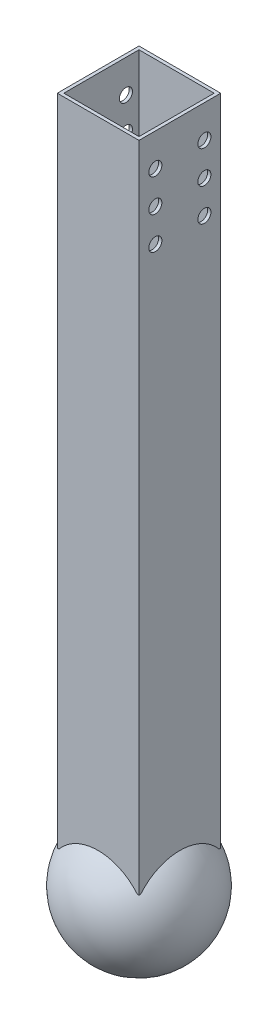
ISO-10303-21;
HEADER;
FILE_DESCRIPTION(('STEP AP214'),'2;1');
FILE_NAME('part.step','',(''),(''),'','','');
FILE_SCHEMA(('AUTOMOTIVE_DESIGN { 1 0 10303 214 1 1 1 1 }'));
ENDSEC;
DATA;
#1=APPLICATION_CONTEXT('core data for automotive mechanical design processes');
#2=APPLICATION_PROTOCOL_DEFINITION('international standard','automotive_design',2000,#1);
#3=PRODUCT_CONTEXT('',#1,'mechanical');
#4=PRODUCT('Part','Part','',(#3));
#5=PRODUCT_RELATED_PRODUCT_CATEGORY('part','',(#4));
#6=PRODUCT_DEFINITION_FORMATION('','',#4);
#7=PRODUCT_DEFINITION_CONTEXT('part definition',#1,'design');
#8=PRODUCT_DEFINITION('design','',#6,#7);
#9=PRODUCT_DEFINITION_SHAPE('','',#8);
#10=(LENGTH_UNIT() NAMED_UNIT(*) SI_UNIT(.MILLI.,.METRE.));
#11=(NAMED_UNIT(*) PLANE_ANGLE_UNIT() SI_UNIT($,.RADIAN.));
#12=(NAMED_UNIT(*) SI_UNIT($,.STERADIAN.) SOLID_ANGLE_UNIT());
#13=UNCERTAINTY_MEASURE_WITH_UNIT(LENGTH_MEASURE(1.E-05),#10,'distance_accuracy_value','');
#14=(GEOMETRIC_REPRESENTATION_CONTEXT(3) GLOBAL_UNCERTAINTY_ASSIGNED_CONTEXT((#13)) GLOBAL_UNIT_ASSIGNED_CONTEXT((#10,
#11,#12)) REPRESENTATION_CONTEXT('',''));
#15=CARTESIAN_POINT('',(0.,0.,0.));
#16=DIRECTION('',(0.,0.,1.));
#17=DIRECTION('',(1.,0.,0.));
#18=AXIS2_PLACEMENT_3D('',#15,#16,#17);
#19=CARTESIAN_POINT('',(0.,0.,0.));
#20=DIRECTION('',(0.,1.,0.));
#21=DIRECTION('',(0.,0.,1.));
#22=AXIS2_PLACEMENT_3D('',#19,#20,#21);
#23=PLANE('',#22);
#24=CARTESIAN_POINT('',(0.,0.,0.));
#25=DIRECTION('',(0.,1.,0.));
#26=DIRECTION('',(0.,0.,1.));
#27=AXIS2_PLACEMENT_3D('',#24,#25,#26);
#28=CIRCLE('',#27,17.3205080756888);
#29=CARTESIAN_POINT('',(-11.9895788082818,0.,12.5));
#30=VERTEX_POINT('',#29);
#31=CARTESIAN_POINT('',(-12.5,0.,11.9895788082818));
#32=VERTEX_POINT('',#31);
#33=EDGE_CURVE('E277',#30,#32,#28,.F.);
#34=ORIENTED_EDGE('',*,*,#33,.F.);
#35=DIRECTION('',(1.,0.,0.));
#36=VECTOR('',#35,1.);
#37=CARTESIAN_POINT('',(-12.5,0.,12.5));
#38=LINE('',#37,#36);
#39=CARTESIAN_POINT('',(-12.5,0.,12.5));
#40=VERTEX_POINT('',#39);
#41=EDGE_CURVE('E319',#40,#30,#38,.T.);
#42=ORIENTED_EDGE('',*,*,#41,.F.);
#43=DIRECTION('',(0.,0.,1.));
#44=VECTOR('',#43,1.);
#45=CARTESIAN_POINT('',(-12.5,0.,-12.5));
#46=LINE('',#45,#44);
#47=EDGE_CURVE('E333',#32,#40,#46,.T.);
#48=ORIENTED_EDGE('',*,*,#47,.F.);
#49=EDGE_LOOP('',(#34,#42,#48));
#50=FACE_BOUND('',#49,.T.);
#51=ADVANCED_FACE('F37',(#50),#23,.F.);
#52=CARTESIAN_POINT('',(-12.5,0.,-11.9895788082818));
#53=VERTEX_POINT('',#52);
#54=CARTESIAN_POINT('',(-11.9895788082818,0.,-12.5));
#55=VERTEX_POINT('',#54);
#56=EDGE_CURVE('E278',#53,#55,#28,.F.);
#57=ORIENTED_EDGE('',*,*,#56,.F.);
#58=CARTESIAN_POINT('',(-12.5,0.,-12.5));
#59=VERTEX_POINT('',#58);
#60=EDGE_CURVE('E334',#59,#53,#46,.T.);
#61=ORIENTED_EDGE('',*,*,#60,.F.);
#62=DIRECTION('',(-1.,0.,0.));
#63=VECTOR('',#62,1.);
#64=CARTESIAN_POINT('',(-12.5,0.,-12.5));
#65=LINE('',#64,#63);
#66=EDGE_CURVE('E328',#55,#59,#65,.T.);
#67=ORIENTED_EDGE('',*,*,#66,.F.);
#68=EDGE_LOOP('',(#57,#61,#67));
#69=FACE_BOUND('',#68,.T.);
#70=ADVANCED_FACE('F355',(#69),#23,.F.);
#71=CARTESIAN_POINT('',(11.9895788082818,0.,-12.5));
#72=VERTEX_POINT('',#71);
#73=CARTESIAN_POINT('',(12.5,0.,-11.9895788082818));
#74=VERTEX_POINT('',#73);
#75=EDGE_CURVE('E283',#72,#74,#28,.F.);
#76=ORIENTED_EDGE('',*,*,#75,.F.);
#77=CARTESIAN_POINT('',(12.5,0.,-12.5));
#78=VERTEX_POINT('',#77);
#79=EDGE_CURVE('E330',#78,#72,#65,.T.);
#80=ORIENTED_EDGE('',*,*,#79,.F.);
#81=DIRECTION('',(0.,0.,-1.));
#82=VECTOR('',#81,1.);
#83=CARTESIAN_POINT('',(12.5,0.,-12.5));
#84=LINE('',#83,#82);
#85=EDGE_CURVE('E314',#74,#78,#84,.T.);
#86=ORIENTED_EDGE('',*,*,#85,.F.);
#87=EDGE_LOOP('',(#76,#80,#86));
#88=FACE_BOUND('',#87,.T.);
#89=ADVANCED_FACE('F389',(#88),#23,.F.);
#90=CARTESIAN_POINT('',(0.,200.,0.));
#91=DIRECTION('',(0.,1.,0.));
#92=DIRECTION('',(0.,0.,1.));
#93=AXIS2_PLACEMENT_3D('',#90,#91,#92);
#94=PLANE('',#93);
#95=DIRECTION('',(0.,0.,-1.));
#96=VECTOR('',#95,1.);
#97=CARTESIAN_POINT('',(12.5,200.,-12.5));
#98=LINE('',#97,#96);
#99=CARTESIAN_POINT('',(12.5,200.,12.5));
#100=VERTEX_POINT('',#99);
#101=CARTESIAN_POINT('',(12.5,200.,-12.5));
#102=VERTEX_POINT('',#101);
#103=EDGE_CURVE('E315',#100,#102,#98,.T.);
#104=ORIENTED_EDGE('',*,*,#103,.T.);
#105=DIRECTION('',(-1.,0.,0.));
#106=VECTOR('',#105,1.);
#107=CARTESIAN_POINT('',(-12.5,200.,-12.5));
#108=LINE('',#107,#106);
#109=CARTESIAN_POINT('',(-12.5,200.,-12.5));
#110=VERTEX_POINT('',#109);
#111=EDGE_CURVE('E318',#102,#110,#108,.T.);
#112=ORIENTED_EDGE('',*,*,#111,.T.);
#113=DIRECTION('',(0.,0.,1.));
#114=VECTOR('',#113,1.);
#115=CARTESIAN_POINT('',(-12.5,200.,-12.5));
#116=LINE('',#115,#114);
#117=CARTESIAN_POINT('',(-12.5,200.,12.5));
#118=VERTEX_POINT('',#117);
#119=EDGE_CURVE('E321',#110,#118,#116,.T.);
#120=ORIENTED_EDGE('',*,*,#119,.T.);
#121=DIRECTION('',(1.,0.,0.));
#122=VECTOR('',#121,1.);
#123=CARTESIAN_POINT('',(-12.5,200.,12.5));
#124=LINE('',#123,#122);
#125=EDGE_CURVE('E323',#118,#100,#124,.T.);
#126=ORIENTED_EDGE('',*,*,#125,.T.);
#127=EDGE_LOOP('',(#104,#112,#120,#126));
#128=FACE_BOUND('',#127,.T.);
#129=DIRECTION('',(1.,0.,0.));
#130=VECTOR('',#129,1.);
#131=CARTESIAN_POINT('',(-11.5,200.,11.5));
#132=LINE('',#131,#130);
#133=CARTESIAN_POINT('',(-11.5,200.,11.5));
#134=VERTEX_POINT('',#133);
#135=CARTESIAN_POINT('',(11.5,200.,11.5));
#136=VERTEX_POINT('',#135);
#137=EDGE_CURVE('E289',#134,#136,#132,.T.);
#138=ORIENTED_EDGE('',*,*,#137,.F.);
#139=DIRECTION('',(0.,0.,1.));
#140=VECTOR('',#139,1.);
#141=CARTESIAN_POINT('',(-11.5,200.,-11.5));
#142=LINE('',#141,#140);
#143=CARTESIAN_POINT('',(-11.5,200.,-11.5));
#144=VERTEX_POINT('',#143);
#145=EDGE_CURVE('E185',#144,#134,#142,.T.);
#146=ORIENTED_EDGE('',*,*,#145,.F.);
#147=DIRECTION('',(-1.,0.,0.));
#148=VECTOR('',#147,1.);
#149=CARTESIAN_POINT('',(-11.5,200.,-11.5));
#150=LINE('',#149,#148);
#151=CARTESIAN_POINT('',(11.5,200.,-11.5));
#152=VERTEX_POINT('',#151);
#153=EDGE_CURVE('E294',#152,#144,#150,.T.);
#154=ORIENTED_EDGE('',*,*,#153,.F.);
#155=DIRECTION('',(0.,0.,-1.));
#156=VECTOR('',#155,1.);
#157=CARTESIAN_POINT('',(11.5,200.,-11.5));
#158=LINE('',#157,#156);
#159=EDGE_CURVE('E291',#136,#152,#158,.T.);
#160=ORIENTED_EDGE('',*,*,#159,.F.);
#161=EDGE_LOOP('',(#138,#146,#154,#160));
#162=FACE_BOUND('',#161,.T.);
#163=ADVANCED_FACE('F414',(#128,#162),#94,.T.);
#164=CARTESIAN_POINT('',(12.5,0.,11.9895788082818));
#165=VERTEX_POINT('',#164);
#166=CARTESIAN_POINT('',(11.9895788082818,0.,12.5));
#167=VERTEX_POINT('',#166);
#168=EDGE_CURVE('E274',#165,#167,#28,.F.);
#169=ORIENTED_EDGE('',*,*,#168,.F.);
#170=CARTESIAN_POINT('',(12.5,0.,12.5));
#171=VERTEX_POINT('',#170);
#172=EDGE_CURVE('E326',#171,#165,#84,.T.);
#173=ORIENTED_EDGE('',*,*,#172,.F.);
#174=EDGE_CURVE('E337',#167,#171,#38,.T.);
#175=ORIENTED_EDGE('',*,*,#174,.F.);
#176=EDGE_LOOP('',(#169,#173,#175));
#177=FACE_BOUND('',#176,.T.);
#178=ADVANCED_FACE('F410',(#177),#23,.F.);
#179=CARTESIAN_POINT('',(12.5,200.,-12.5));
#180=DIRECTION('',(-1.,0.,0.));
#181=DIRECTION('',(0.,0.,1.));
#182=AXIS2_PLACEMENT_3D('',#179,#180,#181);
#183=PLANE('',#182);
#184=CARTESIAN_POINT('',(12.5,180.,-7.5));
#185=DIRECTION('',(1.,0.,0.));
#186=DIRECTION('',(0.,0.,-1.));
#187=AXIS2_PLACEMENT_3D('',#184,#185,#186);
#188=CIRCLE('',#187,2.);
#189=CARTESIAN_POINT('',(12.5,180.,-9.5));
#190=VERTEX_POINT('',#189);
#191=EDGE_CURVE('E685',#190,#190,#188,.T.);
#192=ORIENTED_EDGE('',*,*,#191,.F.);
#193=EDGE_LOOP('',(#192));
#194=FACE_BOUND('',#193,.T.);
#195=CARTESIAN_POINT('',(12.5,170.,-7.5));
#196=DIRECTION('',(1.,0.,0.));
#197=DIRECTION('',(0.,0.,-1.));
#198=AXIS2_PLACEMENT_3D('',#195,#196,#197);
#199=CIRCLE('',#198,2.);
#200=CARTESIAN_POINT('',(12.5,170.,-9.5));
#201=VERTEX_POINT('',#200);
#202=EDGE_CURVE('E698',#201,#201,#199,.T.);
#203=ORIENTED_EDGE('',*,*,#202,.F.);
#204=EDGE_LOOP('',(#203));
#205=FACE_BOUND('',#204,.T.);
#206=CARTESIAN_POINT('',(12.5,190.,7.5));
#207=DIRECTION('',(1.,0.,0.));
#208=DIRECTION('',(0.,0.,-1.));
#209=AXIS2_PLACEMENT_3D('',#206,#207,#208);
#210=CIRCLE('',#209,2.);
#211=CARTESIAN_POINT('',(12.5,190.,5.5));
#212=VERTEX_POINT('',#211);
#213=EDGE_CURVE('E704',#212,#212,#210,.T.);
#214=ORIENTED_EDGE('',*,*,#213,.F.);
#215=EDGE_LOOP('',(#214));
#216=FACE_BOUND('',#215,.T.);
#217=CARTESIAN_POINT('',(12.5,180.,7.5));
#218=DIRECTION('',(1.,0.,0.));
#219=DIRECTION('',(0.,0.,-1.));
#220=AXIS2_PLACEMENT_3D('',#217,#218,#219);
#221=CIRCLE('',#220,2.);
#222=CARTESIAN_POINT('',(12.5,180.,5.5));
#223=VERTEX_POINT('',#222);
#224=EDGE_CURVE('E710',#223,#223,#221,.T.);
#225=ORIENTED_EDGE('',*,*,#224,.F.);
#226=EDGE_LOOP('',(#225));
#227=FACE_BOUND('',#226,.T.);
#228=CARTESIAN_POINT('',(12.5,170.,7.5));
#229=DIRECTION('',(1.,0.,0.));
#230=DIRECTION('',(0.,0.,-1.));
#231=AXIS2_PLACEMENT_3D('',#228,#229,#230);
#232=CIRCLE('',#231,2.);
#233=CARTESIAN_POINT('',(12.5,170.,5.5));
#234=VERTEX_POINT('',#233);
#235=EDGE_CURVE('E693',#234,#234,#232,.T.);
#236=ORIENTED_EDGE('',*,*,#235,.F.);
#237=EDGE_LOOP('',(#236));
#238=FACE_BOUND('',#237,.T.);
#239=CARTESIAN_POINT('',(12.5,190.,-7.5));
#240=DIRECTION('',(1.,0.,0.));
#241=DIRECTION('',(0.,0.,-1.));
#242=AXIS2_PLACEMENT_3D('',#239,#240,#241);
#243=CIRCLE('',#242,2.);
#244=CARTESIAN_POINT('',(12.5,190.,-9.5));
#245=VERTEX_POINT('',#244);
#246=EDGE_CURVE('E684',#245,#245,#243,.T.);
#247=ORIENTED_EDGE('',*,*,#246,.F.);
#248=EDGE_LOOP('',(#247));
#249=FACE_BOUND('',#248,.T.);
#250=CARTESIAN_POINT('',(12.5,-10.,0.));
#251=DIRECTION('',(-1.,0.,0.));
#252=DIRECTION('',(0.,0.,1.));
#253=AXIS2_PLACEMENT_3D('',#250,#251,#252);
#254=CIRCLE('',#253,15.612494995996);
#255=EDGE_CURVE('E55',#74,#165,#254,.F.);
#256=ORIENTED_EDGE('',*,*,#255,.F.);
#257=ORIENTED_EDGE('',*,*,#85,.T.);
#258=DIRECTION('',(0.,-1.,0.));
#259=VECTOR('',#258,1.);
#260=CARTESIAN_POINT('',(12.5,200.,-12.5));
#261=LINE('',#260,#259);
#262=EDGE_CURVE('E202',#102,#78,#261,.T.);
#263=ORIENTED_EDGE('',*,*,#262,.F.);
#264=ORIENTED_EDGE('',*,*,#103,.F.);
#265=DIRECTION('',(0.,-1.,0.));
#266=VECTOR('',#265,1.);
#267=CARTESIAN_POINT('',(12.5,200.,12.5));
#268=LINE('',#267,#266);
#269=EDGE_CURVE('E325',#100,#171,#268,.T.);
#270=ORIENTED_EDGE('',*,*,#269,.T.);
#271=ORIENTED_EDGE('',*,*,#172,.T.);
#272=EDGE_LOOP('',(#256,#257,#263,#264,#270,#271));
#273=FACE_BOUND('',#272,.T.);
#274=ADVANCED_FACE('F39',(#194,#205,#216,#227,#238,#249,#273),#183,.F.);
#275=CARTESIAN_POINT('',(-12.5,200.,-12.5));
#276=DIRECTION('',(0.,0.,1.));
#277=DIRECTION('',(1.,0.,0.));
#278=AXIS2_PLACEMENT_3D('',#275,#276,#277);
#279=PLANE('',#278);
#280=CARTESIAN_POINT('',(0.,-10.,-12.5));
#281=DIRECTION('',(0.,0.,1.));
#282=DIRECTION('',(1.,0.,0.));
#283=AXIS2_PLACEMENT_3D('',#280,#281,#282);
#284=CIRCLE('',#283,15.612494995996);
#285=EDGE_CURVE('E284',#55,#72,#284,.F.);
#286=ORIENTED_EDGE('',*,*,#285,.F.);
#287=ORIENTED_EDGE('',*,*,#66,.T.);
#288=DIRECTION('',(0.,-1.,0.));
#289=VECTOR('',#288,1.);
#290=CARTESIAN_POINT('',(-12.5,200.,-12.5));
#291=LINE('',#290,#289);
#292=EDGE_CURVE('E205',#110,#59,#291,.T.);
#293=ORIENTED_EDGE('',*,*,#292,.F.);
#294=ORIENTED_EDGE('',*,*,#111,.F.);
#295=ORIENTED_EDGE('',*,*,#262,.T.);
#296=ORIENTED_EDGE('',*,*,#79,.T.);
#297=EDGE_LOOP('',(#286,#287,#293,#294,#295,#296));
#298=FACE_BOUND('',#297,.T.);
#299=ADVANCED_FACE('F385',(#298),#279,.F.);
#300=CARTESIAN_POINT('',(-12.5,200.,-12.5));
#301=DIRECTION('',(1.,0.,0.));
#302=DIRECTION('',(0.,0.,-1.));
#303=AXIS2_PLACEMENT_3D('',#300,#301,#302);
#304=PLANE('',#303);
#305=CARTESIAN_POINT('',(-12.5,180.,-7.5));
#306=DIRECTION('',(1.,0.,0.));
#307=DIRECTION('',(0.,0.,-1.));
#308=AXIS2_PLACEMENT_3D('',#305,#306,#307);
#309=CIRCLE('',#308,2.);
#310=CARTESIAN_POINT('',(-12.5,180.,-9.5));
#311=VERTEX_POINT('',#310);
#312=EDGE_CURVE('E683',#311,#311,#309,.T.);
#313=ORIENTED_EDGE('',*,*,#312,.T.);
#314=EDGE_LOOP('',(#313));
#315=FACE_BOUND('',#314,.T.);
#316=CARTESIAN_POINT('',(-12.5,170.,-7.5));
#317=DIRECTION('',(1.,0.,0.));
#318=DIRECTION('',(0.,0.,-1.));
#319=AXIS2_PLACEMENT_3D('',#316,#317,#318);
#320=CIRCLE('',#319,2.);
#321=CARTESIAN_POINT('',(-12.5,170.,-9.5));
#322=VERTEX_POINT('',#321);
#323=EDGE_CURVE('E690',#322,#322,#320,.T.);
#324=ORIENTED_EDGE('',*,*,#323,.T.);
#325=EDGE_LOOP('',(#324));
#326=FACE_BOUND('',#325,.T.);
#327=CARTESIAN_POINT('',(-12.5,190.,7.5));
#328=DIRECTION('',(1.,0.,0.));
#329=DIRECTION('',(0.,0.,-1.));
#330=AXIS2_PLACEMENT_3D('',#327,#328,#329);
#331=CIRCLE('',#330,2.);
#332=CARTESIAN_POINT('',(-12.5,190.,5.5));
#333=VERTEX_POINT('',#332);
#334=EDGE_CURVE('E701',#333,#333,#331,.T.);
#335=ORIENTED_EDGE('',*,*,#334,.T.);
#336=EDGE_LOOP('',(#335));
#337=FACE_BOUND('',#336,.T.);
#338=CARTESIAN_POINT('',(-12.5,180.,7.5));
#339=DIRECTION('',(1.,0.,0.));
#340=DIRECTION('',(0.,0.,-1.));
#341=AXIS2_PLACEMENT_3D('',#338,#339,#340);
#342=CIRCLE('',#341,2.);
#343=CARTESIAN_POINT('',(-12.5,180.,5.5));
#344=VERTEX_POINT('',#343);
#345=EDGE_CURVE('E707',#344,#344,#342,.T.);
#346=ORIENTED_EDGE('',*,*,#345,.T.);
#347=EDGE_LOOP('',(#346));
#348=FACE_BOUND('',#347,.T.);
#349=CARTESIAN_POINT('',(-12.5,170.,7.5));
#350=DIRECTION('',(1.,0.,0.));
#351=DIRECTION('',(0.,0.,-1.));
#352=AXIS2_PLACEMENT_3D('',#349,#350,#351);
#353=CIRCLE('',#352,2.);
#354=CARTESIAN_POINT('',(-12.5,170.,5.5));
#355=VERTEX_POINT('',#354);
#356=EDGE_CURVE('E713',#355,#355,#353,.T.);
#357=ORIENTED_EDGE('',*,*,#356,.T.);
#358=EDGE_LOOP('',(#357));
#359=FACE_BOUND('',#358,.T.);
#360=CARTESIAN_POINT('',(-12.5,190.,-7.5));
#361=DIRECTION('',(1.,0.,0.));
#362=DIRECTION('',(0.,0.,-1.));
#363=AXIS2_PLACEMENT_3D('',#360,#361,#362);
#364=CIRCLE('',#363,2.);
#365=CARTESIAN_POINT('',(-12.5,190.,-9.5));
#366=VERTEX_POINT('',#365);
#367=EDGE_CURVE('E213',#366,#366,#364,.T.);
#368=ORIENTED_EDGE('',*,*,#367,.T.);
#369=EDGE_LOOP('',(#368));
#370=FACE_BOUND('',#369,.T.);
#371=CARTESIAN_POINT('',(-12.5,-10.,0.));
#372=DIRECTION('',(1.,0.,0.));
#373=DIRECTION('',(0.,0.,-1.));
#374=AXIS2_PLACEMENT_3D('',#371,#372,#373);
#375=CIRCLE('',#374,15.612494995996);
#376=EDGE_CURVE('E279',#32,#53,#375,.F.);
#377=ORIENTED_EDGE('',*,*,#376,.F.);
#378=ORIENTED_EDGE('',*,*,#47,.T.);
#379=DIRECTION('',(0.,-1.,0.));
#380=VECTOR('',#379,1.);
#381=CARTESIAN_POINT('',(-12.5,200.,12.5));
#382=LINE('',#381,#380);
#383=EDGE_CURVE('E343',#118,#40,#382,.T.);
#384=ORIENTED_EDGE('',*,*,#383,.F.);
#385=ORIENTED_EDGE('',*,*,#119,.F.);
#386=ORIENTED_EDGE('',*,*,#292,.T.);
#387=ORIENTED_EDGE('',*,*,#60,.T.);
#388=EDGE_LOOP('',(#377,#378,#384,#385,#386,#387));
#389=FACE_BOUND('',#388,.T.);
#390=ADVANCED_FACE('F350',(#315,#326,#337,#348,#359,#370,#389),#304,.F.);
#391=CARTESIAN_POINT('',(-12.5,200.,12.5));
#392=DIRECTION('',(0.,0.,-1.));
#393=DIRECTION('',(-1.,0.,0.));
#394=AXIS2_PLACEMENT_3D('',#391,#392,#393);
#395=PLANE('',#394);
#396=CARTESIAN_POINT('',(0.,-10.,12.5));
#397=DIRECTION('',(0.,0.,-1.));
#398=DIRECTION('',(-1.,0.,0.));
#399=AXIS2_PLACEMENT_3D('',#396,#397,#398);
#400=CIRCLE('',#399,15.612494995996);
#401=EDGE_CURVE('E271',#167,#30,#400,.F.);
#402=ORIENTED_EDGE('',*,*,#401,.F.);
#403=ORIENTED_EDGE('',*,*,#174,.T.);
#404=ORIENTED_EDGE('',*,*,#269,.F.);
#405=ORIENTED_EDGE('',*,*,#125,.F.);
#406=ORIENTED_EDGE('',*,*,#383,.T.);
#407=ORIENTED_EDGE('',*,*,#41,.T.);
#408=EDGE_LOOP('',(#402,#403,#404,#405,#406,#407));
#409=FACE_BOUND('',#408,.T.);
#410=ADVANCED_FACE('F442',(#409),#395,.F.);
#411=CARTESIAN_POINT('',(-11.5,200.,-11.5));
#412=DIRECTION('',(1.,0.,0.));
#413=DIRECTION('',(0.,0.,-1.));
#414=AXIS2_PLACEMENT_3D('',#411,#412,#413);
#415=PLANE('',#414);
#416=CARTESIAN_POINT('',(-11.5,180.,-7.5));
#417=DIRECTION('',(1.,0.,0.));
#418=DIRECTION('',(0.,0.,-1.));
#419=AXIS2_PLACEMENT_3D('',#416,#417,#418);
#420=CIRCLE('',#419,2.);
#421=CARTESIAN_POINT('',(-11.5,180.,-9.5));
#422=VERTEX_POINT('',#421);
#423=EDGE_CURVE('E197',#422,#422,#420,.T.);
#424=ORIENTED_EDGE('',*,*,#423,.F.);
#425=EDGE_LOOP('',(#424));
#426=FACE_BOUND('',#425,.T.);
#427=CARTESIAN_POINT('',(-11.5,170.,-7.5));
#428=DIRECTION('',(1.,0.,0.));
#429=DIRECTION('',(0.,0.,-1.));
#430=AXIS2_PLACEMENT_3D('',#427,#428,#429);
#431=CIRCLE('',#430,2.);
#432=CARTESIAN_POINT('',(-11.5,170.,-9.5));
#433=VERTEX_POINT('',#432);
#434=EDGE_CURVE('E227',#433,#433,#431,.T.);
#435=ORIENTED_EDGE('',*,*,#434,.F.);
#436=EDGE_LOOP('',(#435));
#437=FACE_BOUND('',#436,.T.);
#438=CARTESIAN_POINT('',(-11.5,190.,7.5));
#439=DIRECTION('',(1.,0.,0.));
#440=DIRECTION('',(0.,0.,-1.));
#441=AXIS2_PLACEMENT_3D('',#438,#439,#440);
#442=CIRCLE('',#441,2.);
#443=CARTESIAN_POINT('',(-11.5,190.,5.5));
#444=VERTEX_POINT('',#443);
#445=EDGE_CURVE('E224',#444,#444,#442,.T.);
#446=ORIENTED_EDGE('',*,*,#445,.F.);
#447=EDGE_LOOP('',(#446));
#448=FACE_BOUND('',#447,.T.);
#449=CARTESIAN_POINT('',(-11.5,180.,7.5));
#450=DIRECTION('',(1.,0.,0.));
#451=DIRECTION('',(0.,0.,-1.));
#452=AXIS2_PLACEMENT_3D('',#449,#450,#451);
#453=CIRCLE('',#452,2.);
#454=CARTESIAN_POINT('',(-11.5,180.,5.5));
#455=VERTEX_POINT('',#454);
#456=EDGE_CURVE('E221',#455,#455,#453,.T.);
#457=ORIENTED_EDGE('',*,*,#456,.F.);
#458=EDGE_LOOP('',(#457));
#459=FACE_BOUND('',#458,.T.);
#460=CARTESIAN_POINT('',(-11.5,170.,7.5));
#461=DIRECTION('',(1.,0.,0.));
#462=DIRECTION('',(0.,0.,-1.));
#463=AXIS2_PLACEMENT_3D('',#460,#461,#462);
#464=CIRCLE('',#463,2.);
#465=CARTESIAN_POINT('',(-11.5,170.,5.5));
#466=VERTEX_POINT('',#465);
#467=EDGE_CURVE('E217',#466,#466,#464,.T.);
#468=ORIENTED_EDGE('',*,*,#467,.F.);
#469=EDGE_LOOP('',(#468));
#470=FACE_BOUND('',#469,.T.);
#471=CARTESIAN_POINT('',(-11.5,190.,-7.5));
#472=DIRECTION('',(1.,0.,0.));
#473=DIRECTION('',(0.,0.,-1.));
#474=AXIS2_PLACEMENT_3D('',#471,#472,#473);
#475=CIRCLE('',#474,2.);
#476=CARTESIAN_POINT('',(-11.5,190.,-9.5));
#477=VERTEX_POINT('',#476);
#478=EDGE_CURVE('E212',#477,#477,#475,.T.);
#479=ORIENTED_EDGE('',*,*,#478,.F.);
#480=EDGE_LOOP('',(#479));
#481=FACE_BOUND('',#480,.T.);
#482=DIRECTION('',(0.,-1.,0.));
#483=VECTOR('',#482,1.);
#484=CARTESIAN_POINT('',(-11.5,200.,11.5));
#485=LINE('',#484,#483);
#486=CARTESIAN_POINT('',(-11.5,1.64044672682282,11.5));
#487=VERTEX_POINT('',#486);
#488=EDGE_CURVE('E311',#134,#487,#485,.T.);
#489=ORIENTED_EDGE('',*,*,#488,.T.);
#490=CARTESIAN_POINT('',(-11.5,-10.,0.));
#491=DIRECTION('',(1.,0.,0.));
#492=DIRECTION('',(0.,0.,-1.));
#493=AXIS2_PLACEMENT_3D('',#490,#491,#492);
#494=CIRCLE('',#493,16.3630681719536);
#495=CARTESIAN_POINT('',(-11.5,1.64044672682282,-11.5));
#496=VERTEX_POINT('',#495);
#497=EDGE_CURVE('E268',#487,#496,#494,.F.);
#498=ORIENTED_EDGE('',*,*,#497,.T.);
#499=DIRECTION('',(0.,-1.,0.));
#500=VECTOR('',#499,1.);
#501=CARTESIAN_POINT('',(-11.5,200.,-11.5));
#502=LINE('',#501,#500);
#503=EDGE_CURVE('E296',#144,#496,#502,.T.);
#504=ORIENTED_EDGE('',*,*,#503,.F.);
#505=ORIENTED_EDGE('',*,*,#145,.T.);
#506=EDGE_LOOP('',(#489,#498,#504,#505));
#507=FACE_BOUND('',#506,.T.);
#508=ADVANCED_FACE('F439',(#426,#437,#448,#459,#470,#481,#507),#415,.T.);
#509=CARTESIAN_POINT('',(-11.5,200.,11.5));
#510=DIRECTION('',(0.,0.,-1.));
#511=DIRECTION('',(-1.,0.,0.));
#512=AXIS2_PLACEMENT_3D('',#509,#510,#511);
#513=PLANE('',#512);
#514=DIRECTION('',(0.,-1.,0.));
#515=VECTOR('',#514,1.);
#516=CARTESIAN_POINT('',(11.5,200.,11.5));
#517=LINE('',#516,#515);
#518=CARTESIAN_POINT('',(11.5,1.6404467268228,11.5));
#519=VERTEX_POINT('',#518);
#520=EDGE_CURVE('E308',#136,#519,#517,.T.);
#521=ORIENTED_EDGE('',*,*,#520,.T.);
#522=CARTESIAN_POINT('',(0.,-10.,11.5));
#523=DIRECTION('',(0.,0.,-1.));
#524=DIRECTION('',(-1.,0.,0.));
#525=AXIS2_PLACEMENT_3D('',#522,#523,#524);
#526=CIRCLE('',#525,16.3630681719536);
#527=EDGE_CURVE('E265',#519,#487,#526,.F.);
#528=ORIENTED_EDGE('',*,*,#527,.T.);
#529=ORIENTED_EDGE('',*,*,#488,.F.);
#530=ORIENTED_EDGE('',*,*,#137,.T.);
#531=EDGE_LOOP('',(#521,#528,#529,#530));
#532=FACE_BOUND('',#531,.T.);
#533=ADVANCED_FACE('F407',(#532),#513,.T.);
#534=CARTESIAN_POINT('',(11.5,200.,-11.5));
#535=DIRECTION('',(-1.,0.,0.));
#536=DIRECTION('',(0.,0.,1.));
#537=AXIS2_PLACEMENT_3D('',#534,#535,#536);
#538=PLANE('',#537);
#539=CARTESIAN_POINT('',(11.5,180.,-7.5));
#540=DIRECTION('',(-1.,0.,0.));
#541=DIRECTION('',(0.,0.,1.));
#542=AXIS2_PLACEMENT_3D('',#539,#540,#541);
#543=CIRCLE('',#542,2.);
#544=CARTESIAN_POINT('',(11.5,180.,-5.5));
#545=VERTEX_POINT('',#544);
#546=EDGE_CURVE('E41',#545,#545,#543,.T.);
#547=ORIENTED_EDGE('',*,*,#546,.F.);
#548=EDGE_LOOP('',(#547));
#549=FACE_BOUND('',#548,.T.);
#550=CARTESIAN_POINT('',(11.5,170.,-7.5));
#551=DIRECTION('',(-1.,0.,0.));
#552=DIRECTION('',(0.,0.,1.));
#553=AXIS2_PLACEMENT_3D('',#550,#551,#552);
#554=CIRCLE('',#553,2.);
#555=CARTESIAN_POINT('',(11.5,170.,-5.5));
#556=VERTEX_POINT('',#555);
#557=EDGE_CURVE('E225',#556,#556,#554,.T.);
#558=ORIENTED_EDGE('',*,*,#557,.F.);
#559=EDGE_LOOP('',(#558));
#560=FACE_BOUND('',#559,.T.);
#561=CARTESIAN_POINT('',(11.5,190.,7.5));
#562=DIRECTION('',(-1.,0.,0.));
#563=DIRECTION('',(0.,0.,1.));
#564=AXIS2_PLACEMENT_3D('',#561,#562,#563);
#565=CIRCLE('',#564,2.);
#566=CARTESIAN_POINT('',(11.5,190.,9.5));
#567=VERTEX_POINT('',#566);
#568=EDGE_CURVE('E222',#567,#567,#565,.T.);
#569=ORIENTED_EDGE('',*,*,#568,.F.);
#570=EDGE_LOOP('',(#569));
#571=FACE_BOUND('',#570,.T.);
#572=CARTESIAN_POINT('',(11.5,180.,7.5));
#573=DIRECTION('',(-1.,0.,0.));
#574=DIRECTION('',(0.,0.,1.));
#575=AXIS2_PLACEMENT_3D('',#572,#573,#574);
#576=CIRCLE('',#575,2.);
#577=CARTESIAN_POINT('',(11.5,180.,9.5));
#578=VERTEX_POINT('',#577);
#579=EDGE_CURVE('E218',#578,#578,#576,.T.);
#580=ORIENTED_EDGE('',*,*,#579,.F.);
#581=EDGE_LOOP('',(#580));
#582=FACE_BOUND('',#581,.T.);
#583=CARTESIAN_POINT('',(11.5,170.,7.5));
#584=DIRECTION('',(-1.,0.,0.));
#585=DIRECTION('',(0.,0.,1.));
#586=AXIS2_PLACEMENT_3D('',#583,#584,#585);
#587=CIRCLE('',#586,2.);
#588=CARTESIAN_POINT('',(11.5,170.,9.5));
#589=VERTEX_POINT('',#588);
#590=EDGE_CURVE('E214',#589,#589,#587,.T.);
#591=ORIENTED_EDGE('',*,*,#590,.F.);
#592=EDGE_LOOP('',(#591));
#593=FACE_BOUND('',#592,.T.);
#594=CARTESIAN_POINT('',(11.5,190.,-7.5));
#595=DIRECTION('',(-1.,0.,0.));
#596=DIRECTION('',(0.,0.,1.));
#597=AXIS2_PLACEMENT_3D('',#594,#595,#596);
#598=CIRCLE('',#597,2.);
#599=CARTESIAN_POINT('',(11.5,190.,-5.5));
#600=VERTEX_POINT('',#599);
#601=EDGE_CURVE('E209',#600,#600,#598,.T.);
#602=ORIENTED_EDGE('',*,*,#601,.F.);
#603=EDGE_LOOP('',(#602));
#604=FACE_BOUND('',#603,.T.);
#605=DIRECTION('',(0.,-1.,0.));
#606=VECTOR('',#605,1.);
#607=CARTESIAN_POINT('',(11.5,200.,-11.5));
#608=LINE('',#607,#606);
#609=CARTESIAN_POINT('',(11.5,1.64044672682282,-11.5));
#610=VERTEX_POINT('',#609);
#611=EDGE_CURVE('E305',#152,#610,#608,.T.);
#612=ORIENTED_EDGE('',*,*,#611,.T.);
#613=CARTESIAN_POINT('',(11.5,-10.,0.));
#614=DIRECTION('',(-1.,0.,0.));
#615=DIRECTION('',(0.,0.,1.));
#616=AXIS2_PLACEMENT_3D('',#613,#614,#615);
#617=CIRCLE('',#616,16.3630681719536);
#618=EDGE_CURVE('E262',#610,#519,#617,.F.);
#619=ORIENTED_EDGE('',*,*,#618,.T.);
#620=ORIENTED_EDGE('',*,*,#520,.F.);
#621=ORIENTED_EDGE('',*,*,#159,.T.);
#622=EDGE_LOOP('',(#612,#619,#620,#621));
#623=FACE_BOUND('',#622,.T.);
#624=ADVANCED_FACE('F409',(#549,#560,#571,#582,#593,#604,#623),#538,.T.);
#625=CARTESIAN_POINT('',(-11.5,200.,-11.5));
#626=DIRECTION('',(0.,0.,1.));
#627=DIRECTION('',(1.,0.,0.));
#628=AXIS2_PLACEMENT_3D('',#625,#626,#627);
#629=PLANE('',#628);
#630=ORIENTED_EDGE('',*,*,#503,.T.);
#631=CARTESIAN_POINT('',(0.,-10.,-11.5));
#632=DIRECTION('',(0.,0.,1.));
#633=DIRECTION('',(1.,0.,0.));
#634=AXIS2_PLACEMENT_3D('',#631,#632,#633);
#635=CIRCLE('',#634,16.3630681719536);
#636=EDGE_CURVE('E11',#496,#610,#635,.F.);
#637=ORIENTED_EDGE('',*,*,#636,.T.);
#638=ORIENTED_EDGE('',*,*,#611,.F.);
#639=ORIENTED_EDGE('',*,*,#153,.T.);
#640=EDGE_LOOP('',(#630,#637,#638,#639));
#641=FACE_BOUND('',#640,.T.);
#642=ADVANCED_FACE('F431',(#641),#629,.T.);
#643=CARTESIAN_POINT('',(0.,-10.,0.));
#644=DIRECTION('',(0.,0.,-1.));
#645=DIRECTION('',(-1.,0.,0.));
#646=AXIS2_PLACEMENT_3D('',#643,#644,#645);
#647=SPHERICAL_SURFACE('',#646,20.);
#648=ORIENTED_EDGE('',*,*,#497,.F.);
#649=ORIENTED_EDGE('',*,*,#527,.F.);
#650=ORIENTED_EDGE('',*,*,#618,.F.);
#651=ORIENTED_EDGE('',*,*,#636,.F.);
#652=EDGE_LOOP('',(#648,#649,#650,#651));
#653=FACE_BOUND('',#652,.T.);
#654=ADVANCED_FACE('F428',(#653),#647,.T.);
#655=ORIENTED_EDGE('',*,*,#56,.T.);
#656=ORIENTED_EDGE('',*,*,#285,.T.);
#657=ORIENTED_EDGE('',*,*,#75,.T.);
#658=ORIENTED_EDGE('',*,*,#255,.T.);
#659=ORIENTED_EDGE('',*,*,#168,.T.);
#660=ORIENTED_EDGE('',*,*,#401,.T.);
#661=ORIENTED_EDGE('',*,*,#33,.T.);
#662=ORIENTED_EDGE('',*,*,#376,.T.);
#663=EDGE_LOOP('',(#655,#656,#657,#658,#659,#660,#661,#662));
#664=FACE_BOUND('',#663,.T.);
#665=ADVANCED_FACE('F361',(#664),#647,.T.);
#666=CARTESIAN_POINT('',(-12.5,190.,-7.5));
#667=DIRECTION('',(1.,0.,0.));
#668=DIRECTION('',(0.,0.,-1.));
#669=AXIS2_PLACEMENT_3D('',#666,#667,#668);
#670=CYLINDRICAL_SURFACE('',#669,2.);
#671=ORIENTED_EDGE('',*,*,#601,.T.);
#672=EDGE_LOOP('',(#671));
#673=FACE_BOUND('',#672,.T.);
#674=ORIENTED_EDGE('',*,*,#246,.T.);
#675=EDGE_LOOP('',(#674));
#676=FACE_BOUND('',#675,.T.);
#677=ADVANCED_FACE('F426',(#673,#676),#670,.F.);
#678=CARTESIAN_POINT('',(-12.5,170.,7.5));
#679=DIRECTION('',(1.,0.,0.));
#680=DIRECTION('',(0.,0.,-1.));
#681=AXIS2_PLACEMENT_3D('',#678,#679,#680);
#682=CYLINDRICAL_SURFACE('',#681,2.);
#683=ORIENTED_EDGE('',*,*,#590,.T.);
#684=EDGE_LOOP('',(#683));
#685=FACE_BOUND('',#684,.T.);
#686=ORIENTED_EDGE('',*,*,#235,.T.);
#687=EDGE_LOOP('',(#686));
#688=FACE_BOUND('',#687,.T.);
#689=ADVANCED_FACE('F574',(#685,#688),#682,.F.);
#690=CARTESIAN_POINT('',(-12.5,180.,7.5));
#691=DIRECTION('',(1.,0.,0.));
#692=DIRECTION('',(0.,0.,-1.));
#693=AXIS2_PLACEMENT_3D('',#690,#691,#692);
#694=CYLINDRICAL_SURFACE('',#693,2.);
#695=ORIENTED_EDGE('',*,*,#579,.T.);
#696=EDGE_LOOP('',(#695));
#697=FACE_BOUND('',#696,.T.);
#698=ORIENTED_EDGE('',*,*,#224,.T.);
#699=EDGE_LOOP('',(#698));
#700=FACE_BOUND('',#699,.T.);
#701=ADVANCED_FACE('F586',(#697,#700),#694,.F.);
#702=CARTESIAN_POINT('',(-12.5,190.,7.5));
#703=DIRECTION('',(1.,0.,0.));
#704=DIRECTION('',(0.,0.,-1.));
#705=AXIS2_PLACEMENT_3D('',#702,#703,#704);
#706=CYLINDRICAL_SURFACE('',#705,2.);
#707=ORIENTED_EDGE('',*,*,#568,.T.);
#708=EDGE_LOOP('',(#707));
#709=FACE_BOUND('',#708,.T.);
#710=ORIENTED_EDGE('',*,*,#213,.T.);
#711=EDGE_LOOP('',(#710));
#712=FACE_BOUND('',#711,.T.);
#713=ADVANCED_FACE('F597',(#709,#712),#706,.F.);
#714=CARTESIAN_POINT('',(-12.5,170.,-7.5));
#715=DIRECTION('',(1.,0.,0.));
#716=DIRECTION('',(0.,0.,-1.));
#717=AXIS2_PLACEMENT_3D('',#714,#715,#716);
#718=CYLINDRICAL_SURFACE('',#717,2.);
#719=ORIENTED_EDGE('',*,*,#557,.T.);
#720=EDGE_LOOP('',(#719));
#721=FACE_BOUND('',#720,.T.);
#722=ORIENTED_EDGE('',*,*,#202,.T.);
#723=EDGE_LOOP('',(#722));
#724=FACE_BOUND('',#723,.T.);
#725=ADVANCED_FACE('F607',(#721,#724),#718,.F.);
#726=CARTESIAN_POINT('',(-12.5,180.,-7.5));
#727=DIRECTION('',(1.,0.,0.));
#728=DIRECTION('',(0.,0.,-1.));
#729=AXIS2_PLACEMENT_3D('',#726,#727,#728);
#730=CYLINDRICAL_SURFACE('',#729,2.);
#731=ORIENTED_EDGE('',*,*,#546,.T.);
#732=EDGE_LOOP('',(#731));
#733=FACE_BOUND('',#732,.T.);
#734=ORIENTED_EDGE('',*,*,#191,.T.);
#735=EDGE_LOOP('',(#734));
#736=FACE_BOUND('',#735,.T.);
#737=ADVANCED_FACE('F618',(#733,#736),#730,.F.);
#738=ORIENTED_EDGE('',*,*,#478,.T.);
#739=EDGE_LOOP('',(#738));
#740=FACE_BOUND('',#739,.T.);
#741=ORIENTED_EDGE('',*,*,#367,.F.);
#742=EDGE_LOOP('',(#741));
#743=FACE_BOUND('',#742,.T.);
#744=ADVANCED_FACE('F576',(#740,#743),#670,.F.);
#745=ORIENTED_EDGE('',*,*,#467,.T.);
#746=EDGE_LOOP('',(#745));
#747=FACE_BOUND('',#746,.T.);
#748=ORIENTED_EDGE('',*,*,#356,.F.);
#749=EDGE_LOOP('',(#748));
#750=FACE_BOUND('',#749,.T.);
#751=ADVANCED_FACE('F589',(#747,#750),#682,.F.);
#752=ORIENTED_EDGE('',*,*,#456,.T.);
#753=EDGE_LOOP('',(#752));
#754=FACE_BOUND('',#753,.T.);
#755=ORIENTED_EDGE('',*,*,#345,.F.);
#756=EDGE_LOOP('',(#755));
#757=FACE_BOUND('',#756,.T.);
#758=ADVANCED_FACE('F599',(#754,#757),#694,.F.);
#759=ORIENTED_EDGE('',*,*,#445,.T.);
#760=EDGE_LOOP('',(#759));
#761=FACE_BOUND('',#760,.T.);
#762=ORIENTED_EDGE('',*,*,#334,.F.);
#763=EDGE_LOOP('',(#762));
#764=FACE_BOUND('',#763,.T.);
#765=ADVANCED_FACE('F610',(#761,#764),#706,.F.);
#766=ORIENTED_EDGE('',*,*,#434,.T.);
#767=EDGE_LOOP('',(#766));
#768=FACE_BOUND('',#767,.T.);
#769=ORIENTED_EDGE('',*,*,#323,.F.);
#770=EDGE_LOOP('',(#769));
#771=FACE_BOUND('',#770,.T.);
#772=ADVANCED_FACE('F620',(#768,#771),#718,.F.);
#773=ORIENTED_EDGE('',*,*,#423,.T.);
#774=EDGE_LOOP('',(#773));
#775=FACE_BOUND('',#774,.T.);
#776=ORIENTED_EDGE('',*,*,#312,.F.);
#777=EDGE_LOOP('',(#776));
#778=FACE_BOUND('',#777,.T.);
#779=ADVANCED_FACE('F630',(#775,#778),#730,.F.);
#780=CLOSED_SHELL('',(#51,#70,#89,#163,#178,#274,#299,#390,#410,#508,#533,#624,#642,#654,#665,
#677,#689,#701,#713,#725,#737,#744,#751,#758,#765,#772,#779));
#781=CARTESIAN_POINT('',(0.,-10.,0.));
#782=DIRECTION('',(0.,0.,-1.));
#783=DIRECTION('',(1.,0.,0.));
#784=AXIS2_PLACEMENT_3D('',#781,#782,#783);
#785=SPHERICAL_SURFACE('',#784,19.);
#786=CARTESIAN_POINT('',(0.,-10.,12.5));
#787=DIRECTION('',(0.,0.,-1.));
#788=DIRECTION('',(-1.,0.,0.));
#789=AXIS2_PLACEMENT_3D('',#786,#787,#788);
#790=CIRCLE('',#789,14.3090880212542);
#791=CARTESIAN_POINT('',(10.2347447452294,0.,12.5));
#792=VERTEX_POINT('',#791);
#793=CARTESIAN_POINT('',(-10.2347447452294,0.,12.5));
#794=VERTEX_POINT('',#793);
#795=EDGE_CURVE('E253',#792,#794,#790,.F.);
#796=ORIENTED_EDGE('',*,*,#795,.F.);
#797=CARTESIAN_POINT('',(0.,0.,0.));
#798=DIRECTION('',(0.,1.,0.));
#799=DIRECTION('',(0.,0.,1.));
#800=AXIS2_PLACEMENT_3D('',#797,#798,#799);
#801=CIRCLE('',#800,16.1554944214035);
#802=CARTESIAN_POINT('',(11.3468057179102,0.,11.5));
#803=VERTEX_POINT('',#802);
#804=EDGE_CURVE('E252',#803,#792,#801,.F.);
#805=ORIENTED_EDGE('',*,*,#804,.F.);
#806=CARTESIAN_POINT('',(0.,-10.,11.5));
#807=DIRECTION('',(0.,0.,-1.));
#808=DIRECTION('',(-1.,0.,0.));
#809=AXIS2_PLACEMENT_3D('',#806,#807,#808);
#810=CIRCLE('',#809,15.1244834622542);
#811=CARTESIAN_POINT('',(-11.3468057179102,0.,11.5));
#812=VERTEX_POINT('',#811);
#813=EDGE_CURVE('E249',#803,#812,#810,.F.);
#814=ORIENTED_EDGE('',*,*,#813,.T.);
#815=EDGE_CURVE('E256',#794,#812,#801,.F.);
#816=ORIENTED_EDGE('',*,*,#815,.F.);
#817=EDGE_LOOP('',(#796,#805,#814,#816));
#818=FACE_BOUND('',#817,.T.);
#819=CARTESIAN_POINT('',(0.,-10.,-12.5));
#820=DIRECTION('',(0.,0.,1.));
#821=DIRECTION('',(1.,0.,0.));
#822=AXIS2_PLACEMENT_3D('',#819,#820,#821);
#823=CIRCLE('',#822,14.3090880212542);
#824=CARTESIAN_POINT('',(-10.2347447452294,0.,-12.5));
#825=VERTEX_POINT('',#824);
#826=CARTESIAN_POINT('',(10.2347447452294,0.,-12.5));
#827=VERTEX_POINT('',#826);
#828=EDGE_CURVE('E241',#825,#827,#823,.F.);
#829=ORIENTED_EDGE('',*,*,#828,.F.);
#830=CARTESIAN_POINT('',(-11.3468057179102,0.,-11.5));
#831=VERTEX_POINT('',#830);
#832=EDGE_CURVE('E196',#831,#825,#801,.F.);
#833=ORIENTED_EDGE('',*,*,#832,.F.);
#834=CARTESIAN_POINT('',(0.,-10.,-11.5));
#835=DIRECTION('',(0.,0.,1.));
#836=DIRECTION('',(1.,0.,0.));
#837=AXIS2_PLACEMENT_3D('',#834,#835,#836);
#838=CIRCLE('',#837,15.1244834622542);
#839=CARTESIAN_POINT('',(11.3468057179102,0.,-11.5));
#840=VERTEX_POINT('',#839);
#841=EDGE_CURVE('E47',#831,#840,#838,.F.);
#842=ORIENTED_EDGE('',*,*,#841,.T.);
#843=EDGE_CURVE('E190',#827,#840,#801,.F.);
#844=ORIENTED_EDGE('',*,*,#843,.F.);
#845=EDGE_LOOP('',(#829,#833,#842,#844));
#846=FACE_BOUND('',#845,.T.);
#847=CARTESIAN_POINT('',(12.5,-10.,0.));
#848=DIRECTION('',(-1.,0.,0.));
#849=DIRECTION('',(0.,0.,1.));
#850=AXIS2_PLACEMENT_3D('',#847,#848,#849);
#851=CIRCLE('',#850,14.3090880212542);
#852=CARTESIAN_POINT('',(12.5,0.,-10.2347447452294));
#853=VERTEX_POINT('',#852);
#854=CARTESIAN_POINT('',(12.5,0.,10.2347447452294));
#855=VERTEX_POINT('',#854);
#856=EDGE_CURVE('E247',#853,#855,#851,.F.);
#857=ORIENTED_EDGE('',*,*,#856,.F.);
#858=CARTESIAN_POINT('',(11.5,0.,-11.3468057179102));
#859=VERTEX_POINT('',#858);
#860=EDGE_CURVE('E63',#859,#853,#801,.F.);
#861=ORIENTED_EDGE('',*,*,#860,.F.);
#862=CARTESIAN_POINT('',(11.5,-10.,0.));
#863=DIRECTION('',(-1.,0.,0.));
#864=DIRECTION('',(0.,0.,1.));
#865=AXIS2_PLACEMENT_3D('',#862,#863,#864);
#866=CIRCLE('',#865,15.1244834622542);
#867=CARTESIAN_POINT('',(11.5,0.,11.3468057179102));
#868=VERTEX_POINT('',#867);
#869=EDGE_CURVE('E243',#859,#868,#866,.F.);
#870=ORIENTED_EDGE('',*,*,#869,.T.);
#871=EDGE_CURVE('E246',#855,#868,#801,.F.);
#872=ORIENTED_EDGE('',*,*,#871,.F.);
#873=EDGE_LOOP('',(#857,#861,#870,#872));
#874=FACE_BOUND('',#873,.T.);
#875=CARTESIAN_POINT('',(-12.5,-10.,0.));
#876=DIRECTION('',(1.,0.,0.));
#877=DIRECTION('',(0.,0.,-1.));
#878=AXIS2_PLACEMENT_3D('',#875,#876,#877);
#879=CIRCLE('',#878,14.3090880212542);
#880=CARTESIAN_POINT('',(-12.5,0.,10.2347447452294));
#881=VERTEX_POINT('',#880);
#882=CARTESIAN_POINT('',(-12.5,0.,-10.2347447452294));
#883=VERTEX_POINT('',#882);
#884=EDGE_CURVE('E260',#881,#883,#879,.F.);
#885=ORIENTED_EDGE('',*,*,#884,.F.);
#886=CARTESIAN_POINT('',(-11.5,0.,11.3468057179102));
#887=VERTEX_POINT('',#886);
#888=EDGE_CURVE('E199',#887,#881,#801,.F.);
#889=ORIENTED_EDGE('',*,*,#888,.F.);
#890=CARTESIAN_POINT('',(-11.5,-10.,0.));
#891=DIRECTION('',(1.,0.,0.));
#892=DIRECTION('',(0.,0.,-1.));
#893=AXIS2_PLACEMENT_3D('',#890,#891,#892);
#894=CIRCLE('',#893,15.1244834622542);
#895=CARTESIAN_POINT('',(-11.5,0.,-11.3468057179102));
#896=VERTEX_POINT('',#895);
#897=EDGE_CURVE('E255',#887,#896,#894,.F.);
#898=ORIENTED_EDGE('',*,*,#897,.T.);
#899=EDGE_CURVE('E259',#883,#896,#801,.F.);
#900=ORIENTED_EDGE('',*,*,#899,.F.);
#901=EDGE_LOOP('',(#885,#889,#898,#900));
#902=FACE_BOUND('',#901,.T.);
#903=ADVANCED_FACE('F200',(#818,#846,#874,#902),#785,.F.);
#904=EDGE_CURVE('E193',#827,#825,#65,.T.);
#905=ORIENTED_EDGE('',*,*,#904,.T.);
#906=ORIENTED_EDGE('',*,*,#828,.T.);
#907=EDGE_LOOP('',(#905,#906));
#908=FACE_BOUND('',#907,.T.);
#909=ADVANCED_FACE('F384',(#908),#279,.F.);
#910=ORIENTED_EDGE('',*,*,#841,.F.);
#911=DIRECTION('',(-1.,0.,0.));
#912=VECTOR('',#911,1.);
#913=CARTESIAN_POINT('',(-11.5,0.,-11.5));
#914=LINE('',#913,#912);
#915=EDGE_CURVE('E179',#840,#831,#914,.T.);
#916=ORIENTED_EDGE('',*,*,#915,.F.);
#917=EDGE_LOOP('',(#910,#916));
#918=FACE_BOUND('',#917,.T.);
#919=ADVANCED_FACE('F181',(#918),#629,.T.);
#920=ORIENTED_EDGE('',*,*,#915,.T.);
#921=ORIENTED_EDGE('',*,*,#832,.T.);
#922=ORIENTED_EDGE('',*,*,#904,.F.);
#923=ORIENTED_EDGE('',*,*,#843,.T.);
#924=EDGE_LOOP('',(#920,#921,#922,#923));
#925=FACE_BOUND('',#924,.T.);
#926=ADVANCED_FACE('F191',(#925),#23,.F.);
#927=EDGE_CURVE('E329',#855,#853,#84,.T.);
#928=ORIENTED_EDGE('',*,*,#927,.T.);
#929=ORIENTED_EDGE('',*,*,#856,.T.);
#930=EDGE_LOOP('',(#928,#929));
#931=FACE_BOUND('',#930,.T.);
#932=ADVANCED_FACE('F392',(#931),#183,.F.);
#933=ORIENTED_EDGE('',*,*,#869,.F.);
#934=DIRECTION('',(0.,0.,-1.));
#935=VECTOR('',#934,1.);
#936=CARTESIAN_POINT('',(11.5,0.,-11.5));
#937=LINE('',#936,#935);
#938=EDGE_CURVE('E186',#868,#859,#937,.T.);
#939=ORIENTED_EDGE('',*,*,#938,.F.);
#940=EDGE_LOOP('',(#933,#939));
#941=FACE_BOUND('',#940,.T.);
#942=ADVANCED_FACE('F394',(#941),#538,.T.);
#943=ORIENTED_EDGE('',*,*,#938,.T.);
#944=ORIENTED_EDGE('',*,*,#860,.T.);
#945=ORIENTED_EDGE('',*,*,#927,.F.);
#946=ORIENTED_EDGE('',*,*,#871,.T.);
#947=EDGE_LOOP('',(#943,#944,#945,#946));
#948=FACE_BOUND('',#947,.T.);
#949=ADVANCED_FACE('F395',(#948),#23,.F.);
#950=ORIENTED_EDGE('',*,*,#813,.F.);
#951=DIRECTION('',(1.,0.,0.));
#952=VECTOR('',#951,1.);
#953=CARTESIAN_POINT('',(-11.5,0.,11.5));
#954=LINE('',#953,#952);
#955=EDGE_CURVE('E299',#812,#803,#954,.T.);
#956=ORIENTED_EDGE('',*,*,#955,.F.);
#957=EDGE_LOOP('',(#950,#956));
#958=FACE_BOUND('',#957,.T.);
#959=ADVANCED_FACE('F397',(#958),#513,.T.);
#960=EDGE_CURVE('E340',#794,#792,#38,.T.);
#961=ORIENTED_EDGE('',*,*,#960,.T.);
#962=ORIENTED_EDGE('',*,*,#795,.T.);
#963=EDGE_LOOP('',(#961,#962));
#964=FACE_BOUND('',#963,.T.);
#965=ADVANCED_FACE('F404',(#964),#395,.F.);
#966=ORIENTED_EDGE('',*,*,#960,.F.);
#967=ORIENTED_EDGE('',*,*,#815,.T.);
#968=ORIENTED_EDGE('',*,*,#955,.T.);
#969=ORIENTED_EDGE('',*,*,#804,.T.);
#970=EDGE_LOOP('',(#966,#967,#968,#969));
#971=FACE_BOUND('',#970,.T.);
#972=ADVANCED_FACE('F451',(#971),#23,.F.);
#973=EDGE_CURVE('E338',#883,#881,#46,.T.);
#974=ORIENTED_EDGE('',*,*,#973,.T.);
#975=ORIENTED_EDGE('',*,*,#884,.T.);
#976=EDGE_LOOP('',(#974,#975));
#977=FACE_BOUND('',#976,.T.);
#978=ADVANCED_FACE('F369',(#977),#304,.F.);
#979=ORIENTED_EDGE('',*,*,#897,.F.);
#980=DIRECTION('',(0.,0.,1.));
#981=VECTOR('',#980,1.);
#982=CARTESIAN_POINT('',(-11.5,0.,-11.5));
#983=LINE('',#982,#981);
#984=EDGE_CURVE('E287',#896,#887,#983,.T.);
#985=ORIENTED_EDGE('',*,*,#984,.F.);
#986=EDGE_LOOP('',(#979,#985));
#987=FACE_BOUND('',#986,.T.);
#988=ADVANCED_FACE('F444',(#987),#415,.T.);
#989=ORIENTED_EDGE('',*,*,#984,.T.);
#990=ORIENTED_EDGE('',*,*,#888,.T.);
#991=ORIENTED_EDGE('',*,*,#973,.F.);
#992=ORIENTED_EDGE('',*,*,#899,.T.);
#993=EDGE_LOOP('',(#989,#990,#991,#992));
#994=FACE_BOUND('',#993,.T.);
#995=ADVANCED_FACE('F454',(#994),#23,.F.);
#996=CLOSED_SHELL('',(#903,#909,#919,#926,#932,#942,#949,#959,#965,#972,#978,#988,#995));
#997=ORIENTED_CLOSED_SHELL('',*,#996,.T.);
#998=BREP_WITH_VOIDS('B2',#780,(#997));
#999=ADVANCED_BREP_SHAPE_REPRESENTATION('',(#18,#998),#14);
#1000=SHAPE_DEFINITION_REPRESENTATION(#9,#999);
ENDSEC;
END-ISO-10303-21;
